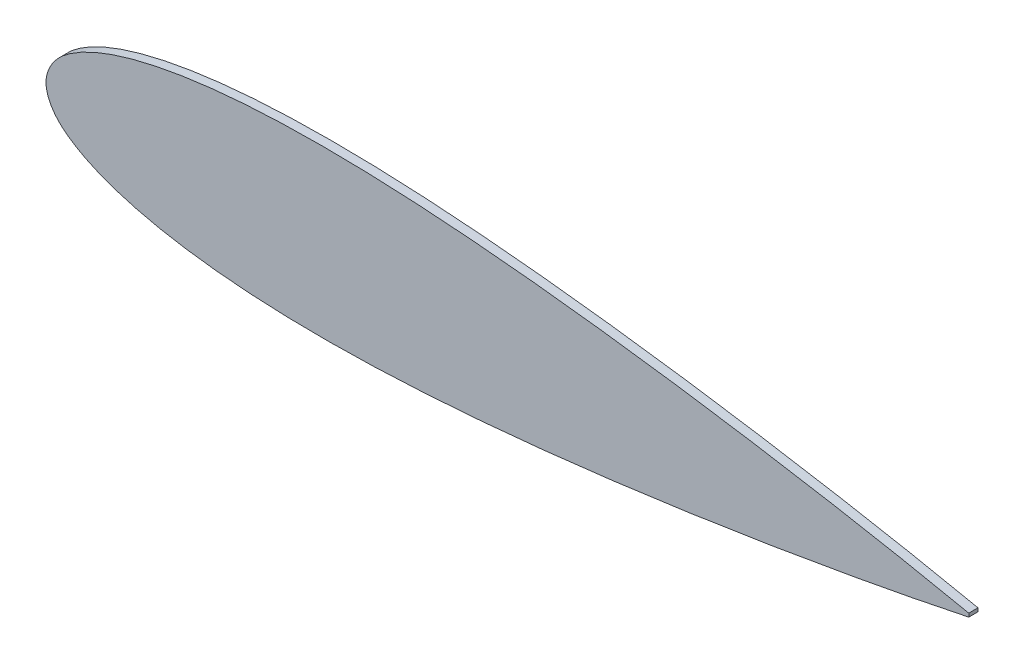
ISO-10303-21;
HEADER;
FILE_DESCRIPTION(('STEP AP214'),'2;1');
FILE_NAME('part.step','',(''),(''),'','','');
FILE_SCHEMA(('AUTOMOTIVE_DESIGN { 1 0 10303 214 1 1 1 1 }'));
ENDSEC;
DATA;
#1=APPLICATION_CONTEXT('core data for automotive mechanical design processes');
#2=APPLICATION_PROTOCOL_DEFINITION('international standard','automotive_design',2000,#1);
#3=PRODUCT_CONTEXT('',#1,'mechanical');
#4=PRODUCT('Part','Part','',(#3));
#5=PRODUCT_RELATED_PRODUCT_CATEGORY('part','',(#4));
#6=PRODUCT_DEFINITION_FORMATION('','',#4);
#7=PRODUCT_DEFINITION_CONTEXT('part definition',#1,'design');
#8=PRODUCT_DEFINITION('design','',#6,#7);
#9=PRODUCT_DEFINITION_SHAPE('','',#8);
#10=(LENGTH_UNIT() NAMED_UNIT(*) SI_UNIT(.MILLI.,.METRE.));
#11=(NAMED_UNIT(*) PLANE_ANGLE_UNIT() SI_UNIT($,.RADIAN.));
#12=(NAMED_UNIT(*) SI_UNIT($,.STERADIAN.) SOLID_ANGLE_UNIT());
#13=UNCERTAINTY_MEASURE_WITH_UNIT(LENGTH_MEASURE(1.E-05),#10,'distance_accuracy_value','');
#14=(GEOMETRIC_REPRESENTATION_CONTEXT(3) GLOBAL_UNCERTAINTY_ASSIGNED_CONTEXT((#13)) GLOBAL_UNIT_ASSIGNED_CONTEXT((#10,
#11,#12)) REPRESENTATION_CONTEXT('',''));
#15=CARTESIAN_POINT('',(0.,0.,0.));
#16=DIRECTION('',(0.,0.,1.));
#17=DIRECTION('',(1.,0.,0.));
#18=AXIS2_PLACEMENT_3D('',#15,#16,#17);
#19=CARTESIAN_POINT('',(1.,0.00189,0.01));
#20=CARTESIAN_POINT('',(0.983341445795391,0.00533383088587595,0.01));
#21=CARTESIAN_POINT('',(0.950061799212309,0.0122137481563763,0.01));
#22=CARTESIAN_POINT('',(0.883441372362755,0.0249783184315284,0.01));
#23=CARTESIAN_POINT('',(0.800162879137988,0.0396567415462466,0.01));
#24=CARTESIAN_POINT('',(0.700149964078349,0.0552816883421639,0.01));
#25=CARTESIAN_POINT('',(0.600152497644821,0.0688428885444711,0.01));
#26=CARTESIAN_POINT('',(0.500153663183443,0.0799341723845413,0.01));
#27=CARTESIAN_POINT('',(0.400130751804431,0.087795051985318,0.01));
#28=CARTESIAN_POINT('',(0.316680276725972,0.0905872864465215,0.01));
#29=CARTESIAN_POINT('',(0.249959662440044,0.0894728788336329,0.01));
#30=CARTESIAN_POINT('',(0.19987869064554,0.0865073068998032,0.01));
#31=CARTESIAN_POINT('',(0.149703564711899,0.0807817220179745,0.01));
#32=CARTESIAN_POINT('',(0.107943069680722,0.072780769684437,0.01));
#33=CARTESIAN_POINT('',(0.0746353079945999,0.0632648637746227,0.01));
#34=CARTESIAN_POINT('',(0.049199656749092,0.0536509358861061,0.01));
#35=CARTESIAN_POINT('',(0.0278945712823605,0.0420738168548886,0.01));
#36=CARTESIAN_POINT('',(0.00829702632641414,0.0260612480041271,0.01));
#37=CARTESIAN_POINT('',(-0.00541427307075743,0.,0.01));
#38=CARTESIAN_POINT('',(0.00829702632641114,-0.0260612480040133,0.01));
#39=CARTESIAN_POINT('',(0.0278945712823557,-0.0420738168547771,0.01));
#40=CARTESIAN_POINT('',(0.0491996567490857,-0.053650935885997,0.01));
#41=CARTESIAN_POINT('',(0.0746353079945927,-0.0632648637745166,0.01));
#42=CARTESIAN_POINT('',(0.107943069680713,-0.0727807696843347,0.01));
#43=CARTESIAN_POINT('',(0.149703564711889,-0.080781722017877,0.01));
#44=CARTESIAN_POINT('',(0.19987869064553,-0.0865073068997114,0.01));
#45=CARTESIAN_POINT('',(0.249959662440034,-0.0894728788335469,0.01));
#46=CARTESIAN_POINT('',(0.316680276725962,-0.0905872864464432,0.01));
#47=CARTESIAN_POINT('',(0.400130751804421,-0.0877950519852492,0.01));
#48=CARTESIAN_POINT('',(0.500153663183434,-0.079934172384484,0.01));
#49=CARTESIAN_POINT('',(0.600152497644814,-0.0688428885444252,0.01));
#50=CARTESIAN_POINT('',(0.700149964078342,-0.0552816883421295,0.01));
#51=CARTESIAN_POINT('',(0.800162879137984,-0.0396567415462238,0.01));
#52=CARTESIAN_POINT('',(0.883441372362753,-0.0249783184315149,0.01));
#53=CARTESIAN_POINT('',(0.950061799212308,-0.0122137481563706,0.01));
#54=CARTESIAN_POINT('',(0.983341445795391,-0.00533383088587405,0.01));
#55=CARTESIAN_POINT('',(1.,-0.00189,0.01));
#56=B_SPLINE_CURVE_WITH_KNOTS('',3,(#19,#20,#21,#22,#23,#24,#25,#26,#27,#28,#29,#30,#31,#32,#33,
#34,#35,#36,#37,#38,#39,#40,#41,#42,#43,#44,#45,#46,#47,#48,#49,#50,#51,#52,#53,#54,#55),
.UNSPECIFIED.,.F.,.F.,(4,1,1,1,1,1,1,1,1,1,1,1,1,1,1,1,1,1,1,1,1,1,1,1,1,1,1,1,1,1,1,1,1,1,4),
(0.,0.0246038442030289,0.0491523591786544,0.0981086674933051,0.146905311902654,
0.195554796743804,0.244056276541371,0.292409554252618,0.340643731361213,0.364754110742025,
0.388905600274471,0.413178107881669,0.437756238827356,0.450304696837969,0.463229878965421,
0.477067953120696,0.485035558645787,0.5,0.514964441354213,0.522932046879304,0.536770121034579,
0.549695303162031,0.562243761172644,0.586821892118331,0.611094399725529,0.635245889257975,
0.659356268638787,0.707590445747382,0.755943723458629,0.804445203256196,0.853094688097346,
0.901891332506695,0.950847640821346,0.975396155796971,1.),.UNSPECIFIED.);
#57=DIRECTION('',(0.,0.,-1.));
#58=VECTOR('',#57,1.);
#59=SURFACE_OF_LINEAR_EXTRUSION('',#56,#58);
#60=CARTESIAN_POINT('',(1.,0.00189,0.));
#61=CARTESIAN_POINT('',(0.983341445795391,0.00533383088587595,0.));
#62=CARTESIAN_POINT('',(0.950061799212309,0.0122137481563763,0.));
#63=CARTESIAN_POINT('',(0.883441372362755,0.0249783184315284,0.));
#64=CARTESIAN_POINT('',(0.800162879137988,0.0396567415462466,0.));
#65=CARTESIAN_POINT('',(0.700149964078349,0.0552816883421639,0.));
#66=CARTESIAN_POINT('',(0.600152497644821,0.0688428885444711,0.));
#67=CARTESIAN_POINT('',(0.500153663183443,0.0799341723845413,0.));
#68=CARTESIAN_POINT('',(0.400130751804431,0.087795051985318,0.));
#69=CARTESIAN_POINT('',(0.316680276725972,0.0905872864465215,0.));
#70=CARTESIAN_POINT('',(0.249959662440044,0.0894728788336329,0.));
#71=CARTESIAN_POINT('',(0.19987869064554,0.0865073068998032,0.));
#72=CARTESIAN_POINT('',(0.149703564711899,0.0807817220179745,0.));
#73=CARTESIAN_POINT('',(0.107943069680722,0.072780769684437,0.));
#74=CARTESIAN_POINT('',(0.0746353079945999,0.0632648637746227,0.));
#75=CARTESIAN_POINT('',(0.049199656749092,0.0536509358861061,0.));
#76=CARTESIAN_POINT('',(0.0278945712823605,0.0420738168548886,0.));
#77=CARTESIAN_POINT('',(0.00829702632641414,0.0260612480041271,0.));
#78=CARTESIAN_POINT('',(-0.00541427307075743,0.,0.));
#79=CARTESIAN_POINT('',(0.00829702632641114,-0.0260612480040133,0.));
#80=CARTESIAN_POINT('',(0.0278945712823557,-0.0420738168547771,0.));
#81=CARTESIAN_POINT('',(0.0491996567490857,-0.053650935885997,0.));
#82=CARTESIAN_POINT('',(0.0746353079945927,-0.0632648637745166,0.));
#83=CARTESIAN_POINT('',(0.107943069680713,-0.0727807696843347,0.));
#84=CARTESIAN_POINT('',(0.149703564711889,-0.080781722017877,0.));
#85=CARTESIAN_POINT('',(0.19987869064553,-0.0865073068997114,0.));
#86=CARTESIAN_POINT('',(0.249959662440034,-0.0894728788335469,0.));
#87=CARTESIAN_POINT('',(0.316680276725962,-0.0905872864464432,0.));
#88=CARTESIAN_POINT('',(0.400130751804421,-0.0877950519852492,0.));
#89=CARTESIAN_POINT('',(0.500153663183434,-0.079934172384484,0.));
#90=CARTESIAN_POINT('',(0.600152497644814,-0.0688428885444252,0.));
#91=CARTESIAN_POINT('',(0.700149964078342,-0.0552816883421295,0.));
#92=CARTESIAN_POINT('',(0.800162879137984,-0.0396567415462238,0.));
#93=CARTESIAN_POINT('',(0.883441372362753,-0.0249783184315149,0.));
#94=CARTESIAN_POINT('',(0.950061799212308,-0.0122137481563706,0.));
#95=CARTESIAN_POINT('',(0.983341445795391,-0.00533383088587405,0.));
#96=CARTESIAN_POINT('',(1.,-0.00189,0.));
#97=B_SPLINE_CURVE_WITH_KNOTS('',3,(#60,#61,#62,#63,#64,#65,#66,#67,#68,#69,#70,#71,#72,#73,#74,
#75,#76,#77,#78,#79,#80,#81,#82,#83,#84,#85,#86,#87,#88,#89,#90,#91,#92,#93,#94,#95,#96),
.UNSPECIFIED.,.F.,.F.,(4,1,1,1,1,1,1,1,1,1,1,1,1,1,1,1,1,1,1,1,1,1,1,1,1,1,1,1,1,1,1,1,1,1,4),
(0.,0.0246038442030289,0.0491523591786544,0.0981086674933051,0.146905311902654,
0.195554796743804,0.244056276541371,0.292409554252618,0.340643731361213,0.364754110742025,
0.388905600274471,0.413178107881669,0.437756238827356,0.450304696837969,0.463229878965421,
0.477067953120696,0.485035558645787,0.5,0.514964441354213,0.522932046879304,0.536770121034579,
0.549695303162031,0.562243761172644,0.586821892118331,0.611094399725529,0.635245889257975,
0.659356268638787,0.707590445747382,0.755943723458629,0.804445203256196,0.853094688097346,
0.901891332506695,0.950847640821346,0.975396155796971,1.),.UNSPECIFIED.);
#98=CARTESIAN_POINT('',(1.,0.00189,0.));
#99=VERTEX_POINT('',#98);
#100=CARTESIAN_POINT('',(1.,-0.00189,0.));
#101=VERTEX_POINT('',#100);
#102=EDGE_CURVE('E67',#99,#101,#97,.T.);
#103=ORIENTED_EDGE('',*,*,#102,.T.);
#104=DIRECTION('',(0.,0.,-1.));
#105=VECTOR('',#104,1.);
#106=CARTESIAN_POINT('',(1.,-0.00189,0.01));
#107=LINE('',#106,#105);
#108=CARTESIAN_POINT('',(1.,-0.00189,0.01));
#109=VERTEX_POINT('',#108);
#110=EDGE_CURVE('E11',#109,#101,#107,.T.);
#111=ORIENTED_EDGE('',*,*,#110,.F.);
#112=CARTESIAN_POINT('',(1.,0.00189,0.01));
#113=VERTEX_POINT('',#112);
#114=EDGE_CURVE('E66',#113,#109,#56,.T.);
#115=ORIENTED_EDGE('',*,*,#114,.F.);
#116=DIRECTION('',(0.,0.,-1.));
#117=VECTOR('',#116,1.);
#118=CARTESIAN_POINT('',(1.,0.00189,0.01));
#119=LINE('',#118,#117);
#120=EDGE_CURVE('E44',#113,#99,#119,.T.);
#121=ORIENTED_EDGE('',*,*,#120,.T.);
#122=EDGE_LOOP('',(#103,#111,#115,#121));
#123=FACE_BOUND('',#122,.T.);
#124=ADVANCED_FACE('F35',(#123),#59,.F.);
#125=CARTESIAN_POINT('',(1.,0.00189,0.01));
#126=DIRECTION('',(-1.,0.,0.));
#127=DIRECTION('',(0.,-1.,0.));
#128=AXIS2_PLACEMENT_3D('',#125,#126,#127);
#129=PLANE('',#128);
#130=DIRECTION('',(0.,1.,0.));
#131=VECTOR('',#130,1.);
#132=CARTESIAN_POINT('',(1.,0.00189,0.));
#133=LINE('',#132,#131);
#134=EDGE_CURVE('E59',#101,#99,#133,.T.);
#135=ORIENTED_EDGE('',*,*,#134,.T.);
#136=ORIENTED_EDGE('',*,*,#120,.F.);
#137=DIRECTION('',(0.,1.,0.));
#138=VECTOR('',#137,1.);
#139=CARTESIAN_POINT('',(1.,0.00189,0.01));
#140=LINE('',#139,#138);
#141=EDGE_CURVE('E51',#109,#113,#140,.T.);
#142=ORIENTED_EDGE('',*,*,#141,.F.);
#143=ORIENTED_EDGE('',*,*,#110,.T.);
#144=EDGE_LOOP('',(#135,#136,#142,#143));
#145=FACE_BOUND('',#144,.T.);
#146=ADVANCED_FACE('F62',(#145),#129,.F.);
#147=CARTESIAN_POINT('',(0.,0.,0.01));
#148=DIRECTION('',(0.,0.,-1.));
#149=DIRECTION('',(-1.,0.,0.));
#150=AXIS2_PLACEMENT_3D('',#147,#148,#149);
#151=PLANE('',#150);
#152=ORIENTED_EDGE('',*,*,#114,.T.);
#153=ORIENTED_EDGE('',*,*,#141,.T.);
#154=EDGE_LOOP('',(#152,#153));
#155=FACE_BOUND('',#154,.T.);
#156=ADVANCED_FACE('F84',(#155),#151,.F.);
#157=CARTESIAN_POINT('',(0.,0.,0.));
#158=DIRECTION('',(0.,0.,-1.));
#159=DIRECTION('',(-1.,0.,0.));
#160=AXIS2_PLACEMENT_3D('',#157,#158,#159);
#161=PLANE('',#160);
#162=ORIENTED_EDGE('',*,*,#102,.F.);
#163=ORIENTED_EDGE('',*,*,#134,.F.);
#164=EDGE_LOOP('',(#162,#163));
#165=FACE_BOUND('',#164,.T.);
#166=ADVANCED_FACE('F70',(#165),#161,.T.);
#167=CLOSED_SHELL('',(#124,#146,#156,#166));
#168=MANIFOLD_SOLID_BREP('B2',#167);
#169=ADVANCED_BREP_SHAPE_REPRESENTATION('',(#18,#168),#14);
#170=SHAPE_DEFINITION_REPRESENTATION(#9,#169);
ENDSEC;
END-ISO-10303-21;
